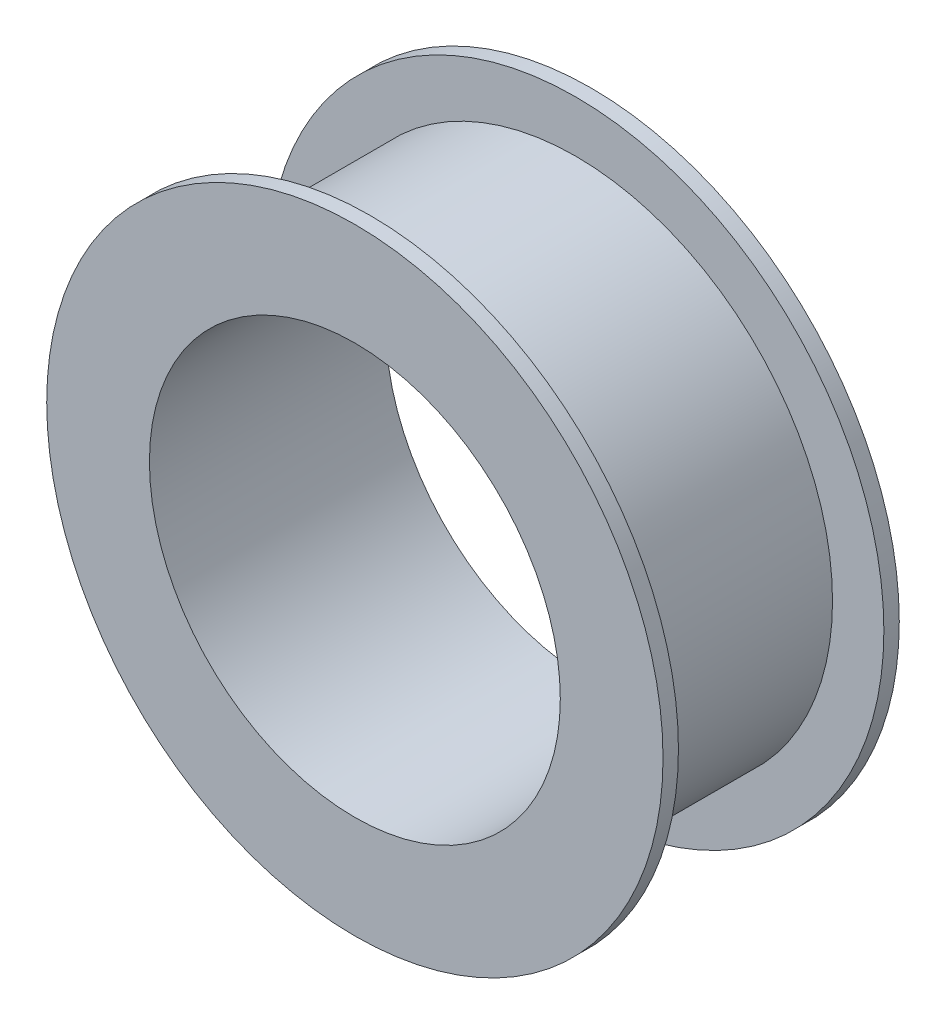
ISO-10303-21;
HEADER;
FILE_DESCRIPTION(('STEP AP214'),'2;1');
FILE_NAME('part.step','',(''),(''),'','','');
FILE_SCHEMA(('AUTOMOTIVE_DESIGN { 1 0 10303 214 1 1 1 1 }'));
ENDSEC;
DATA;
#1=APPLICATION_CONTEXT('core data for automotive mechanical design processes');
#2=APPLICATION_PROTOCOL_DEFINITION('international standard','automotive_design',2000,#1);
#3=PRODUCT_CONTEXT('',#1,'mechanical');
#4=PRODUCT('Part','Part','',(#3));
#5=PRODUCT_RELATED_PRODUCT_CATEGORY('part','',(#4));
#6=PRODUCT_DEFINITION_FORMATION('','',#4);
#7=PRODUCT_DEFINITION_CONTEXT('part definition',#1,'design');
#8=PRODUCT_DEFINITION('design','',#6,#7);
#9=PRODUCT_DEFINITION_SHAPE('','',#8);
#10=(LENGTH_UNIT() NAMED_UNIT(*) SI_UNIT(.MILLI.,.METRE.));
#11=(NAMED_UNIT(*) PLANE_ANGLE_UNIT() SI_UNIT($,.RADIAN.));
#12=(NAMED_UNIT(*) SI_UNIT($,.STERADIAN.) SOLID_ANGLE_UNIT());
#13=UNCERTAINTY_MEASURE_WITH_UNIT(LENGTH_MEASURE(1.E-05),#10,'distance_accuracy_value','');
#14=(GEOMETRIC_REPRESENTATION_CONTEXT(3) GLOBAL_UNCERTAINTY_ASSIGNED_CONTEXT((#13)) GLOBAL_UNIT_ASSIGNED_CONTEXT((#10,
#11,#12)) REPRESENTATION_CONTEXT('',''));
#15=CARTESIAN_POINT('',(0.,0.,0.));
#16=DIRECTION('',(0.,0.,1.));
#17=DIRECTION('',(1.,0.,0.));
#18=AXIS2_PLACEMENT_3D('',#15,#16,#17);
#19=CARTESIAN_POINT('',(0.,0.,40.));
#20=DIRECTION('',(0.,0.,-1.));
#21=DIRECTION('',(-1.,0.,0.));
#22=AXIS2_PLACEMENT_3D('',#19,#20,#21);
#23=CYLINDRICAL_SURFACE('',#22,50.);
#24=CARTESIAN_POINT('',(0.,0.,40.));
#25=DIRECTION('',(0.,0.,1.));
#26=DIRECTION('',(1.,0.,0.));
#27=AXIS2_PLACEMENT_3D('',#24,#25,#26);
#28=CIRCLE('',#27,50.);
#29=CARTESIAN_POINT('',(50.,0.,40.));
#30=VERTEX_POINT('',#29);
#31=EDGE_CURVE('E10',#30,#30,#28,.T.);
#32=ORIENTED_EDGE('',*,*,#31,.F.);
#33=EDGE_LOOP('',(#32));
#34=FACE_BOUND('',#33,.T.);
#35=CARTESIAN_POINT('',(0.,0.,0.));
#36=DIRECTION('',(0.,0.,-1.));
#37=DIRECTION('',(-1.,0.,0.));
#38=AXIS2_PLACEMENT_3D('',#35,#36,#37);
#39=CIRCLE('',#38,50.);
#40=CARTESIAN_POINT('',(-50.,0.,0.));
#41=VERTEX_POINT('',#40);
#42=EDGE_CURVE('E52',#41,#41,#39,.T.);
#43=ORIENTED_EDGE('',*,*,#42,.F.);
#44=EDGE_LOOP('',(#43));
#45=FACE_BOUND('',#44,.T.);
#46=ADVANCED_FACE('F33',(#34,#45),#23,.T.);
#47=CARTESIAN_POINT('',(0.,0.,40.));
#48=DIRECTION('',(0.,0.,-1.));
#49=DIRECTION('',(-1.,0.,0.));
#50=AXIS2_PLACEMENT_3D('',#47,#48,#49);
#51=CYLINDRICAL_SURFACE('',#50,40.);
#52=CARTESIAN_POINT('',(0.,0.,43.));
#53=DIRECTION('',(0.,0.,1.));
#54=DIRECTION('',(1.,0.,0.));
#55=AXIS2_PLACEMENT_3D('',#52,#53,#54);
#56=CIRCLE('',#55,40.);
#57=CARTESIAN_POINT('',(40.,0.,43.));
#58=VERTEX_POINT('',#57);
#59=EDGE_CURVE('E48',#58,#58,#56,.T.);
#60=ORIENTED_EDGE('',*,*,#59,.T.);
#61=EDGE_LOOP('',(#60));
#62=FACE_BOUND('',#61,.T.);
#63=CARTESIAN_POINT('',(0.,0.,-3.));
#64=DIRECTION('',(0.,0.,-1.));
#65=DIRECTION('',(-1.,0.,0.));
#66=AXIS2_PLACEMENT_3D('',#63,#64,#65);
#67=CIRCLE('',#66,40.);
#68=CARTESIAN_POINT('',(-40.,0.,-3.));
#69=VERTEX_POINT('',#68);
#70=EDGE_CURVE('E59',#69,#69,#67,.T.);
#71=ORIENTED_EDGE('',*,*,#70,.T.);
#72=EDGE_LOOP('',(#71));
#73=FACE_BOUND('',#72,.T.);
#74=ADVANCED_FACE('F65',(#62,#73),#51,.F.);
#75=CARTESIAN_POINT('',(0.,0.,40.));
#76=DIRECTION('',(0.,0.,1.));
#77=DIRECTION('',(1.,0.,0.));
#78=AXIS2_PLACEMENT_3D('',#75,#76,#77);
#79=PLANE('',#78);
#80=CARTESIAN_POINT('',(0.,0.,40.));
#81=DIRECTION('',(0.,0.,1.));
#82=DIRECTION('',(1.,0.,0.));
#83=AXIS2_PLACEMENT_3D('',#80,#81,#82);
#84=CIRCLE('',#83,60.);
#85=CARTESIAN_POINT('',(60.,0.,40.));
#86=VERTEX_POINT('',#85);
#87=EDGE_CURVE('E43',#86,#86,#84,.T.);
#88=ORIENTED_EDGE('',*,*,#87,.F.);
#89=EDGE_LOOP('',(#88));
#90=FACE_BOUND('',#89,.T.);
#91=ORIENTED_EDGE('',*,*,#31,.T.);
#92=EDGE_LOOP('',(#91));
#93=FACE_BOUND('',#92,.T.);
#94=ADVANCED_FACE('F87',(#90,#93),#79,.F.);
#95=CARTESIAN_POINT('',(0.,0.,43.));
#96=DIRECTION('',(0.,0.,1.));
#97=DIRECTION('',(1.,0.,0.));
#98=AXIS2_PLACEMENT_3D('',#95,#96,#97);
#99=PLANE('',#98);
#100=CARTESIAN_POINT('',(0.,0.,43.));
#101=DIRECTION('',(0.,0.,1.));
#102=DIRECTION('',(1.,0.,0.));
#103=AXIS2_PLACEMENT_3D('',#100,#101,#102);
#104=CIRCLE('',#103,60.);
#105=CARTESIAN_POINT('',(60.,0.,43.));
#106=VERTEX_POINT('',#105);
#107=EDGE_CURVE('E39',#106,#106,#104,.T.);
#108=ORIENTED_EDGE('',*,*,#107,.T.);
#109=EDGE_LOOP('',(#108));
#110=FACE_BOUND('',#109,.T.);
#111=ORIENTED_EDGE('',*,*,#59,.F.);
#112=EDGE_LOOP('',(#111));
#113=FACE_BOUND('',#112,.T.);
#114=ADVANCED_FACE('F95',(#110,#113),#99,.T.);
#115=CARTESIAN_POINT('',(0.,0.,43.));
#116=DIRECTION('',(0.,0.,-1.));
#117=DIRECTION('',(-1.,0.,0.));
#118=AXIS2_PLACEMENT_3D('',#115,#116,#117);
#119=CYLINDRICAL_SURFACE('',#118,60.);
#120=ORIENTED_EDGE('',*,*,#107,.F.);
#121=EDGE_LOOP('',(#120));
#122=FACE_BOUND('',#121,.T.);
#123=ORIENTED_EDGE('',*,*,#87,.T.);
#124=EDGE_LOOP('',(#123));
#125=FACE_BOUND('',#124,.T.);
#126=ADVANCED_FACE('F79',(#122,#125),#119,.T.);
#127=CARTESIAN_POINT('',(0.,0.,0.));
#128=DIRECTION('',(0.,0.,-1.));
#129=DIRECTION('',(-1.,0.,0.));
#130=AXIS2_PLACEMENT_3D('',#127,#128,#129);
#131=PLANE('',#130);
#132=CARTESIAN_POINT('',(0.,0.,0.));
#133=DIRECTION('',(0.,0.,-1.));
#134=DIRECTION('',(-1.,0.,0.));
#135=AXIS2_PLACEMENT_3D('',#132,#133,#134);
#136=CIRCLE('',#135,60.);
#137=CARTESIAN_POINT('',(-60.,0.,0.));
#138=VERTEX_POINT('',#137);
#139=EDGE_CURVE('E56',#138,#138,#136,.T.);
#140=ORIENTED_EDGE('',*,*,#139,.F.);
#141=EDGE_LOOP('',(#140));
#142=FACE_BOUND('',#141,.T.);
#143=ORIENTED_EDGE('',*,*,#42,.T.);
#144=EDGE_LOOP('',(#143));
#145=FACE_BOUND('',#144,.T.);
#146=ADVANCED_FACE('F70',(#142,#145),#131,.F.);
#147=CARTESIAN_POINT('',(0.,0.,-3.));
#148=DIRECTION('',(0.,0.,-1.));
#149=DIRECTION('',(-1.,0.,0.));
#150=AXIS2_PLACEMENT_3D('',#147,#148,#149);
#151=PLANE('',#150);
#152=CARTESIAN_POINT('',(0.,0.,-3.));
#153=DIRECTION('',(0.,0.,-1.));
#154=DIRECTION('',(-1.,0.,0.));
#155=AXIS2_PLACEMENT_3D('',#152,#153,#154);
#156=CIRCLE('',#155,60.);
#157=CARTESIAN_POINT('',(-60.,0.,-3.));
#158=VERTEX_POINT('',#157);
#159=EDGE_CURVE('E55',#158,#158,#156,.T.);
#160=ORIENTED_EDGE('',*,*,#159,.T.);
#161=EDGE_LOOP('',(#160));
#162=FACE_BOUND('',#161,.T.);
#163=ORIENTED_EDGE('',*,*,#70,.F.);
#164=EDGE_LOOP('',(#163));
#165=FACE_BOUND('',#164,.T.);
#166=ADVANCED_FACE('F67',(#162,#165),#151,.T.);
#167=CARTESIAN_POINT('',(0.,0.,-3.));
#168=DIRECTION('',(0.,0.,1.));
#169=DIRECTION('',(1.,0.,0.));
#170=AXIS2_PLACEMENT_3D('',#167,#168,#169);
#171=CYLINDRICAL_SURFACE('',#170,60.);
#172=ORIENTED_EDGE('',*,*,#159,.F.);
#173=EDGE_LOOP('',(#172));
#174=FACE_BOUND('',#173,.T.);
#175=ORIENTED_EDGE('',*,*,#139,.T.);
#176=EDGE_LOOP('',(#175));
#177=FACE_BOUND('',#176,.T.);
#178=ADVANCED_FACE('F69',(#174,#177),#171,.T.);
#179=CLOSED_SHELL('',(#46,#74,#94,#114,#126,#146,#166,#178));
#180=MANIFOLD_SOLID_BREP('B2',#179);
#181=ADVANCED_BREP_SHAPE_REPRESENTATION('',(#18,#180),#14);
#182=SHAPE_DEFINITION_REPRESENTATION(#9,#181);
ENDSEC;
END-ISO-10303-21;
